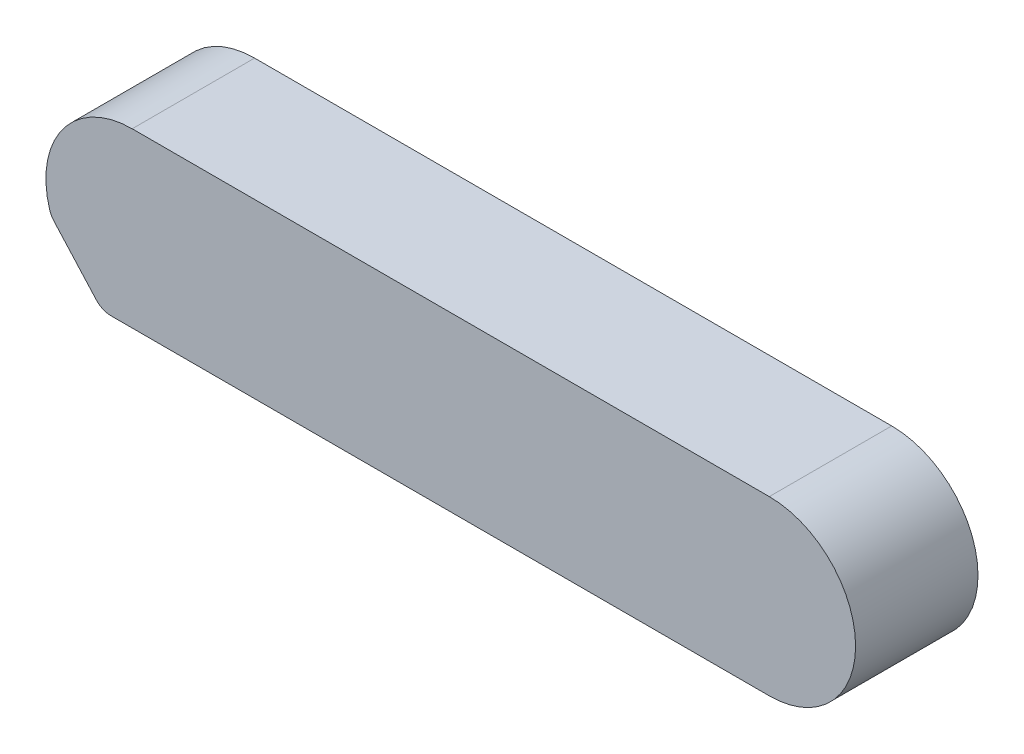
ISO-10303-21;
HEADER;
FILE_DESCRIPTION(('STEP AP214'),'2;1');
FILE_NAME('part.step','',(''),(''),'','','');
FILE_SCHEMA(('AUTOMOTIVE_DESIGN { 1 0 10303 214 1 1 1 1 }'));
ENDSEC;
DATA;
#1=APPLICATION_CONTEXT('core data for automotive mechanical design processes');
#2=APPLICATION_PROTOCOL_DEFINITION('international standard','automotive_design',2000,#1);
#3=PRODUCT_CONTEXT('',#1,'mechanical');
#4=PRODUCT('Part','Part','',(#3));
#5=PRODUCT_RELATED_PRODUCT_CATEGORY('part','',(#4));
#6=PRODUCT_DEFINITION_FORMATION('','',#4);
#7=PRODUCT_DEFINITION_CONTEXT('part definition',#1,'design');
#8=PRODUCT_DEFINITION('design','',#6,#7);
#9=PRODUCT_DEFINITION_SHAPE('','',#8);
#10=(LENGTH_UNIT() NAMED_UNIT(*) SI_UNIT(.MILLI.,.METRE.));
#11=(NAMED_UNIT(*) PLANE_ANGLE_UNIT() SI_UNIT($,.RADIAN.));
#12=(NAMED_UNIT(*) SI_UNIT($,.STERADIAN.) SOLID_ANGLE_UNIT());
#13=UNCERTAINTY_MEASURE_WITH_UNIT(LENGTH_MEASURE(1.E-05),#10,'distance_accuracy_value','');
#14=(GEOMETRIC_REPRESENTATION_CONTEXT(3) GLOBAL_UNCERTAINTY_ASSIGNED_CONTEXT((#13)) GLOBAL_UNIT_ASSIGNED_CONTEXT((#10,
#11,#12)) REPRESENTATION_CONTEXT('',''));
#15=CARTESIAN_POINT('',(0.,0.,0.));
#16=DIRECTION('',(0.,0.,1.));
#17=DIRECTION('',(1.,0.,0.));
#18=AXIS2_PLACEMENT_3D('',#15,#16,#17);
#19=CARTESIAN_POINT('',(0.,0.,60.));
#20=DIRECTION('',(0.,0.,-1.));
#21=DIRECTION('',(-1.,0.,0.));
#22=AXIS2_PLACEMENT_3D('',#19,#20,#21);
#23=CYLINDRICAL_SURFACE('',#22,43.);
#24=DIRECTION('',(0.,0.,-1.));
#25=VECTOR('',#24,1.);
#26=CARTESIAN_POINT('',(0.,-43.,60.));
#27=LINE('',#26,#25);
#28=CARTESIAN_POINT('',(0.,-43.,60.));
#29=VERTEX_POINT('',#28);
#30=CARTESIAN_POINT('',(0.,-43.,-1.));
#31=VERTEX_POINT('',#30);
#32=EDGE_CURVE('E107',#29,#31,#27,.T.);
#33=ORIENTED_EDGE('',*,*,#32,.T.);
#34=CARTESIAN_POINT('',(0.,0.,-1.));
#35=DIRECTION('',(0.,0.,1.));
#36=DIRECTION('',(-1.,0.,0.));
#37=AXIS2_PLACEMENT_3D('',#34,#35,#36);
#38=CIRCLE('',#37,43.);
#39=CARTESIAN_POINT('',(0.,43.,-1.));
#40=VERTEX_POINT('',#39);
#41=EDGE_CURVE('E101',#31,#40,#38,.T.);
#42=ORIENTED_EDGE('',*,*,#41,.T.);
#43=DIRECTION('',(0.,0.,-1.));
#44=VECTOR('',#43,1.);
#45=CARTESIAN_POINT('',(0.,43.,60.));
#46=LINE('',#45,#44);
#47=CARTESIAN_POINT('',(0.,43.,60.));
#48=VERTEX_POINT('',#47);
#49=EDGE_CURVE('E11',#48,#40,#46,.T.);
#50=ORIENTED_EDGE('',*,*,#49,.F.);
#51=CARTESIAN_POINT('',(0.,0.,60.));
#52=DIRECTION('',(0.,0.,1.));
#53=DIRECTION('',(-1.,0.,0.));
#54=AXIS2_PLACEMENT_3D('',#51,#52,#53);
#55=CIRCLE('',#54,43.);
#56=EDGE_CURVE('E122',#29,#48,#55,.T.);
#57=ORIENTED_EDGE('',*,*,#56,.F.);
#58=EDGE_LOOP('',(#33,#42,#50,#57));
#59=FACE_BOUND('',#58,.T.);
#60=ADVANCED_FACE('F31',(#59),#23,.T.);
#61=CARTESIAN_POINT('',(0.,43.,60.));
#62=DIRECTION('',(0.,-1.,0.));
#63=DIRECTION('',(1.,0.,0.));
#64=AXIS2_PLACEMENT_3D('',#61,#62,#63);
#65=PLANE('',#64);
#66=ORIENTED_EDGE('',*,*,#49,.T.);
#67=DIRECTION('',(-1.,0.,0.));
#68=VECTOR('',#67,1.);
#69=CARTESIAN_POINT('',(0.,43.,-1.));
#70=LINE('',#69,#68);
#71=CARTESIAN_POINT('',(-317.5,43.,-1.));
#72=VERTEX_POINT('',#71);
#73=EDGE_CURVE('E91',#40,#72,#70,.T.);
#74=ORIENTED_EDGE('',*,*,#73,.T.);
#75=DIRECTION('',(0.,0.,-1.));
#76=VECTOR('',#75,1.);
#77=CARTESIAN_POINT('',(-317.5,43.,60.));
#78=LINE('',#77,#76);
#79=CARTESIAN_POINT('',(-317.5,43.,60.));
#80=VERTEX_POINT('',#79);
#81=EDGE_CURVE('E38',#80,#72,#78,.T.);
#82=ORIENTED_EDGE('',*,*,#81,.F.);
#83=DIRECTION('',(-1.,0.,0.));
#84=VECTOR('',#83,1.);
#85=CARTESIAN_POINT('',(0.,43.,60.));
#86=LINE('',#85,#84);
#87=EDGE_CURVE('E92',#48,#80,#86,.T.);
#88=ORIENTED_EDGE('',*,*,#87,.F.);
#89=EDGE_LOOP('',(#66,#74,#82,#88));
#90=FACE_BOUND('',#89,.T.);
#91=ADVANCED_FACE('F89',(#90),#65,.F.);
#92=CARTESIAN_POINT('',(-317.5,0.,60.));
#93=DIRECTION('',(0.,0.,-1.));
#94=DIRECTION('',(-1.,0.,0.));
#95=AXIS2_PLACEMENT_3D('',#92,#93,#94);
#96=CYLINDRICAL_SURFACE('',#95,43.);
#97=ORIENTED_EDGE('',*,*,#81,.T.);
#98=CARTESIAN_POINT('',(-317.5,0.,-1.));
#99=DIRECTION('',(0.,0.,1.));
#100=DIRECTION('',(1.,0.,0.));
#101=AXIS2_PLACEMENT_3D('',#98,#99,#100);
#102=CIRCLE('',#101,43.);
#103=CARTESIAN_POINT('',(-358.610595586293,-12.6063051898734,-1.));
#104=VERTEX_POINT('',#103);
#105=EDGE_CURVE('E105',#72,#104,#102,.T.);
#106=ORIENTED_EDGE('',*,*,#105,.T.);
#107=DIRECTION('',(0.,0.,-1.));
#108=VECTOR('',#107,1.);
#109=CARTESIAN_POINT('',(-358.610595586293,-12.6063051898734,60.));
#110=LINE('',#109,#108);
#111=CARTESIAN_POINT('',(-358.610595586293,-12.6063051898734,60.));
#112=VERTEX_POINT('',#111);
#113=EDGE_CURVE('E140',#112,#104,#110,.T.);
#114=ORIENTED_EDGE('',*,*,#113,.F.);
#115=CARTESIAN_POINT('',(-317.5,0.,60.));
#116=DIRECTION('',(0.,0.,1.));
#117=DIRECTION('',(1.,0.,0.));
#118=AXIS2_PLACEMENT_3D('',#115,#116,#117);
#119=CIRCLE('',#118,43.);
#120=EDGE_CURVE('E125',#80,#112,#119,.T.);
#121=ORIENTED_EDGE('',*,*,#120,.F.);
#122=EDGE_LOOP('',(#97,#106,#114,#121));
#123=FACE_BOUND('',#122,.T.);
#124=ADVANCED_FACE('F143',(#123),#96,.T.);
#125=CARTESIAN_POINT('',(-349.049991961574,-9.6746063085075,60.));
#126=DIRECTION('',(0.,0.,-1.));
#127=DIRECTION('',(-1.,0.,0.));
#128=AXIS2_PLACEMENT_3D('',#125,#126,#127);
#129=CYLINDRICAL_SURFACE('',#128,10.0000000000001);
#130=ORIENTED_EDGE('',*,*,#113,.T.);
#131=CARTESIAN_POINT('',(-349.049991961574,-9.6746063085075,-1.));
#132=DIRECTION('',(0.,0.,1.));
#133=DIRECTION('',(-1.,0.,0.));
#134=AXIS2_PLACEMENT_3D('',#131,#132,#133);
#135=CIRCLE('',#134,10.0000000000001);
#136=CARTESIAN_POINT('',(-356.481440216348,-16.3659123720961,-1.));
#137=VERTEX_POINT('',#136);
#138=EDGE_CURVE('E111',#104,#137,#135,.T.);
#139=ORIENTED_EDGE('',*,*,#138,.T.);
#140=DIRECTION('',(0.,0.,-1.));
#141=VECTOR('',#140,1.);
#142=CARTESIAN_POINT('',(-356.481440216348,-16.3659123720961,60.));
#143=LINE('',#142,#141);
#144=CARTESIAN_POINT('',(-356.481440216348,-16.3659123720961,60.));
#145=VERTEX_POINT('',#144);
#146=EDGE_CURVE('E138',#145,#137,#143,.T.);
#147=ORIENTED_EDGE('',*,*,#146,.F.);
#148=CARTESIAN_POINT('',(-349.049991961574,-9.6746063085075,60.));
#149=DIRECTION('',(0.,0.,1.));
#150=DIRECTION('',(-1.,0.,0.));
#151=AXIS2_PLACEMENT_3D('',#148,#149,#150);
#152=CIRCLE('',#151,10.0000000000001);
#153=EDGE_CURVE('E127',#112,#145,#152,.T.);
#154=ORIENTED_EDGE('',*,*,#153,.F.);
#155=EDGE_LOOP('',(#130,#139,#147,#154));
#156=FACE_BOUND('',#155,.T.);
#157=ADVANCED_FACE('F151',(#156),#129,.T.);
#158=CARTESIAN_POINT('',(-356.481440216348,-16.3659123720961,60.));
#159=DIRECTION('',(0.74314482547739,0.669130606358863,0.));
#160=DIRECTION('',(-0.669130606358863,0.74314482547739,0.));
#161=AXIS2_PLACEMENT_3D('',#158,#159,#160);
#162=PLANE('',#161);
#163=ORIENTED_EDGE('',*,*,#146,.T.);
#164=DIRECTION('',(0.669130606358863,-0.74314482547739,0.));
#165=VECTOR('',#164,1.);
#166=CARTESIAN_POINT('',(-356.481440216348,-16.3659123720961,-1.));
#167=LINE('',#166,#165);
#168=CARTESIAN_POINT('',(-335.479161401689,-39.6913060635886,-1.));
#169=VERTEX_POINT('',#168);
#170=EDGE_CURVE('E114',#137,#169,#167,.T.);
#171=ORIENTED_EDGE('',*,*,#170,.T.);
#172=DIRECTION('',(0.,0.,-1.));
#173=VECTOR('',#172,1.);
#174=CARTESIAN_POINT('',(-335.479161401689,-39.6913060635886,60.));
#175=LINE('',#174,#173);
#176=CARTESIAN_POINT('',(-335.479161401689,-39.6913060635886,60.));
#177=VERTEX_POINT('',#176);
#178=EDGE_CURVE('E136',#177,#169,#175,.T.);
#179=ORIENTED_EDGE('',*,*,#178,.F.);
#180=DIRECTION('',(0.669130606358863,-0.74314482547739,0.));
#181=VECTOR('',#180,1.);
#182=CARTESIAN_POINT('',(-356.481440216348,-16.3659123720961,60.));
#183=LINE('',#182,#181);
#184=EDGE_CURVE('E129',#145,#177,#183,.T.);
#185=ORIENTED_EDGE('',*,*,#184,.F.);
#186=EDGE_LOOP('',(#163,#171,#179,#185));
#187=FACE_BOUND('',#186,.T.);
#188=ADVANCED_FACE('F154',(#187),#162,.F.);
#189=CARTESIAN_POINT('',(-328.047713146915,-33.,60.));
#190=DIRECTION('',(0.,0.,-1.));
#191=DIRECTION('',(-1.,0.,0.));
#192=AXIS2_PLACEMENT_3D('',#189,#190,#191);
#193=CYLINDRICAL_SURFACE('',#192,9.99999999999998);
#194=ORIENTED_EDGE('',*,*,#178,.T.);
#195=CARTESIAN_POINT('',(-328.047713146915,-33.,-1.));
#196=DIRECTION('',(0.,0.,1.));
#197=DIRECTION('',(-1.,0.,0.));
#198=AXIS2_PLACEMENT_3D('',#195,#196,#197);
#199=CIRCLE('',#198,9.99999999999998);
#200=CARTESIAN_POINT('',(-328.047713146915,-43.,-1.));
#201=VERTEX_POINT('',#200);
#202=EDGE_CURVE('E117',#169,#201,#199,.T.);
#203=ORIENTED_EDGE('',*,*,#202,.T.);
#204=DIRECTION('',(0.,0.,-1.));
#205=VECTOR('',#204,1.);
#206=CARTESIAN_POINT('',(-328.047713146915,-43.,60.));
#207=LINE('',#206,#205);
#208=CARTESIAN_POINT('',(-328.047713146915,-43.,60.));
#209=VERTEX_POINT('',#208);
#210=EDGE_CURVE('E134',#209,#201,#207,.T.);
#211=ORIENTED_EDGE('',*,*,#210,.F.);
#212=CARTESIAN_POINT('',(-328.047713146915,-33.,60.));
#213=DIRECTION('',(0.,0.,1.));
#214=DIRECTION('',(-1.,0.,0.));
#215=AXIS2_PLACEMENT_3D('',#212,#213,#214);
#216=CIRCLE('',#215,9.99999999999998);
#217=EDGE_CURVE('E50',#177,#209,#216,.T.);
#218=ORIENTED_EDGE('',*,*,#217,.F.);
#219=EDGE_LOOP('',(#194,#203,#211,#218));
#220=FACE_BOUND('',#219,.T.);
#221=ADVANCED_FACE('F157',(#220),#193,.T.);
#222=CARTESIAN_POINT('',(0.,-43.,60.));
#223=DIRECTION('',(0.,1.,0.));
#224=DIRECTION('',(-1.,0.,0.));
#225=AXIS2_PLACEMENT_3D('',#222,#223,#224);
#226=PLANE('',#225);
#227=ORIENTED_EDGE('',*,*,#210,.T.);
#228=DIRECTION('',(1.,0.,0.));
#229=VECTOR('',#228,1.);
#230=CARTESIAN_POINT('',(0.,-43.,-1.));
#231=LINE('',#230,#229);
#232=EDGE_CURVE('E120',#201,#31,#231,.T.);
#233=ORIENTED_EDGE('',*,*,#232,.T.);
#234=ORIENTED_EDGE('',*,*,#32,.F.);
#235=DIRECTION('',(1.,0.,0.));
#236=VECTOR('',#235,1.);
#237=CARTESIAN_POINT('',(0.,-43.,60.));
#238=LINE('',#237,#236);
#239=EDGE_CURVE('E45',#209,#29,#238,.T.);
#240=ORIENTED_EDGE('',*,*,#239,.F.);
#241=EDGE_LOOP('',(#227,#233,#234,#240));
#242=FACE_BOUND('',#241,.T.);
#243=ADVANCED_FACE('F159',(#242),#226,.F.);
#244=CARTESIAN_POINT('',(0.,0.,60.));
#245=DIRECTION('',(0.,0.,-1.));
#246=DIRECTION('',(-1.,0.,0.));
#247=AXIS2_PLACEMENT_3D('',#244,#245,#246);
#248=PLANE('',#247);
#249=ORIENTED_EDGE('',*,*,#56,.T.);
#250=ORIENTED_EDGE('',*,*,#87,.T.);
#251=ORIENTED_EDGE('',*,*,#120,.T.);
#252=ORIENTED_EDGE('',*,*,#153,.T.);
#253=ORIENTED_EDGE('',*,*,#184,.T.);
#254=ORIENTED_EDGE('',*,*,#217,.T.);
#255=ORIENTED_EDGE('',*,*,#239,.T.);
#256=EDGE_LOOP('',(#249,#250,#251,#252,#253,#254,#255));
#257=FACE_BOUND('',#256,.T.);
#258=ADVANCED_FACE('F146',(#257),#248,.F.);
#259=CARTESIAN_POINT('',(0.,0.,-1.));
#260=DIRECTION('',(0.,0.,-1.));
#261=DIRECTION('',(-1.,0.,0.));
#262=AXIS2_PLACEMENT_3D('',#259,#260,#261);
#263=PLANE('',#262);
#264=ORIENTED_EDGE('',*,*,#41,.F.);
#265=ORIENTED_EDGE('',*,*,#232,.F.);
#266=ORIENTED_EDGE('',*,*,#202,.F.);
#267=ORIENTED_EDGE('',*,*,#170,.F.);
#268=ORIENTED_EDGE('',*,*,#138,.F.);
#269=ORIENTED_EDGE('',*,*,#105,.F.);
#270=ORIENTED_EDGE('',*,*,#73,.F.);
#271=EDGE_LOOP('',(#264,#265,#266,#267,#268,#269,#270));
#272=FACE_BOUND('',#271,.T.);
#273=ADVANCED_FACE('F99',(#272),#263,.T.);
#274=CLOSED_SHELL('',(#60,#91,#124,#157,#188,#221,#243,#258,#273));
#275=MANIFOLD_SOLID_BREP('B2',#274);
#276=ADVANCED_BREP_SHAPE_REPRESENTATION('',(#18,#275),#14);
#277=SHAPE_DEFINITION_REPRESENTATION(#9,#276);
ENDSEC;
END-ISO-10303-21;
